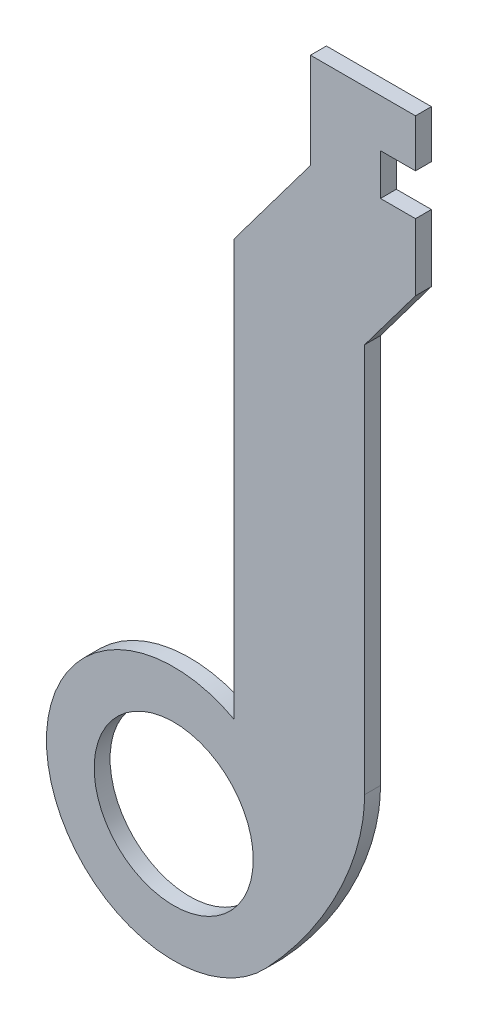
ISO-10303-21;
HEADER;
FILE_DESCRIPTION(('STEP AP214'),'2;1');
FILE_NAME('part.step','',(''),(''),'','','');
FILE_SCHEMA(('AUTOMOTIVE_DESIGN { 1 0 10303 214 1 1 1 1 }'));
ENDSEC;
DATA;
#1=APPLICATION_CONTEXT('core data for automotive mechanical design processes');
#2=APPLICATION_PROTOCOL_DEFINITION('international standard','automotive_design',2000,#1);
#3=PRODUCT_CONTEXT('',#1,'mechanical');
#4=PRODUCT('Part','Part','',(#3));
#5=PRODUCT_RELATED_PRODUCT_CATEGORY('part','',(#4));
#6=PRODUCT_DEFINITION_FORMATION('','',#4);
#7=PRODUCT_DEFINITION_CONTEXT('part definition',#1,'design');
#8=PRODUCT_DEFINITION('design','',#6,#7);
#9=PRODUCT_DEFINITION_SHAPE('','',#8);
#10=(LENGTH_UNIT() NAMED_UNIT(*) SI_UNIT(.MILLI.,.METRE.));
#11=(NAMED_UNIT(*) PLANE_ANGLE_UNIT() SI_UNIT($,.RADIAN.));
#12=(NAMED_UNIT(*) SI_UNIT($,.STERADIAN.) SOLID_ANGLE_UNIT());
#13=UNCERTAINTY_MEASURE_WITH_UNIT(LENGTH_MEASURE(1.E-05),#10,'distance_accuracy_value','');
#14=(GEOMETRIC_REPRESENTATION_CONTEXT(3) GLOBAL_UNCERTAINTY_ASSIGNED_CONTEXT((#13)) GLOBAL_UNIT_ASSIGNED_CONTEXT((#10,
#11,#12)) REPRESENTATION_CONTEXT('',''));
#15=CARTESIAN_POINT('',(0.,0.,0.));
#16=DIRECTION('',(0.,0.,1.));
#17=DIRECTION('',(1.,0.,0.));
#18=AXIS2_PLACEMENT_3D('',#15,#16,#17);
#19=CARTESIAN_POINT('',(-3.3,0.,0.5));
#20=DIRECTION('',(0.,-1.,0.));
#21=DIRECTION('',(0.,0.,-1.));
#22=AXIS2_PLACEMENT_3D('',#19,#20,#21);
#23=PLANE('',#22);
#24=DIRECTION('',(-1.,0.,0.));
#25=VECTOR('',#24,1.);
#26=CARTESIAN_POINT('',(-3.3,0.,0.));
#27=LINE('',#26,#25);
#28=CARTESIAN_POINT('',(0.,0.,0.));
#29=VERTEX_POINT('',#28);
#30=CARTESIAN_POINT('',(-3.3,0.,0.));
#31=VERTEX_POINT('',#30);
#32=EDGE_CURVE('E170',#29,#31,#27,.T.);
#33=ORIENTED_EDGE('',*,*,#32,.T.);
#34=DIRECTION('',(0.,0.,-1.));
#35=VECTOR('',#34,1.);
#36=CARTESIAN_POINT('',(-3.3,0.,0.5));
#37=LINE('',#36,#35);
#38=CARTESIAN_POINT('',(-3.3,0.,0.5));
#39=VERTEX_POINT('',#38);
#40=EDGE_CURVE('E11',#39,#31,#37,.T.);
#41=ORIENTED_EDGE('',*,*,#40,.F.);
#42=DIRECTION('',(-1.,0.,0.));
#43=VECTOR('',#42,1.);
#44=CARTESIAN_POINT('',(-3.3,0.,0.5));
#45=LINE('',#44,#43);
#46=CARTESIAN_POINT('',(0.,0.,0.5));
#47=VERTEX_POINT('',#46);
#48=EDGE_CURVE('E208',#47,#39,#45,.T.);
#49=ORIENTED_EDGE('',*,*,#48,.F.);
#50=DIRECTION('',(0.,0.,-1.));
#51=VECTOR('',#50,1.);
#52=CARTESIAN_POINT('',(0.,0.,0.5));
#53=LINE('',#52,#51);
#54=EDGE_CURVE('E166',#47,#29,#53,.T.);
#55=ORIENTED_EDGE('',*,*,#54,.T.);
#56=EDGE_LOOP('',(#33,#41,#49,#55));
#57=FACE_BOUND('',#56,.T.);
#58=ADVANCED_FACE('F39',(#57),#23,.F.);
#59=CARTESIAN_POINT('',(-3.3,-3.,0.5));
#60=DIRECTION('',(1.,0.,0.));
#61=DIRECTION('',(0.,0.,-1.));
#62=AXIS2_PLACEMENT_3D('',#59,#60,#61);
#63=PLANE('',#62);
#64=DIRECTION('',(0.,-1.,0.));
#65=VECTOR('',#64,1.);
#66=CARTESIAN_POINT('',(-3.3,-3.,0.));
#67=LINE('',#66,#65);
#68=CARTESIAN_POINT('',(-3.3,-3.,0.));
#69=VERTEX_POINT('',#68);
#70=EDGE_CURVE('E174',#31,#69,#67,.T.);
#71=ORIENTED_EDGE('',*,*,#70,.T.);
#72=DIRECTION('',(0.,0.,-1.));
#73=VECTOR('',#72,1.);
#74=CARTESIAN_POINT('',(-3.3,-3.,0.5));
#75=LINE('',#74,#73);
#76=CARTESIAN_POINT('',(-3.3,-3.,0.5));
#77=VERTEX_POINT('',#76);
#78=EDGE_CURVE('E48',#77,#69,#75,.T.);
#79=ORIENTED_EDGE('',*,*,#78,.F.);
#80=DIRECTION('',(0.,-1.,0.));
#81=VECTOR('',#80,1.);
#82=CARTESIAN_POINT('',(-3.3,-3.,0.5));
#83=LINE('',#82,#81);
#84=EDGE_CURVE('E114',#39,#77,#83,.T.);
#85=ORIENTED_EDGE('',*,*,#84,.F.);
#86=ORIENTED_EDGE('',*,*,#40,.T.);
#87=EDGE_LOOP('',(#71,#79,#85,#86));
#88=FACE_BOUND('',#87,.T.);
#89=ADVANCED_FACE('F292',(#88),#63,.F.);
#90=CARTESIAN_POINT('',(-5.7,-6.2,0.5));
#91=DIRECTION('',(0.8,-0.6,0.));
#92=DIRECTION('',(0.6,0.8,0.));
#93=AXIS2_PLACEMENT_3D('',#90,#91,#92);
#94=PLANE('',#93);
#95=DIRECTION('',(-0.6,-0.8,0.));
#96=VECTOR('',#95,1.);
#97=CARTESIAN_POINT('',(-5.7,-6.2,0.));
#98=LINE('',#97,#96);
#99=CARTESIAN_POINT('',(-5.7,-6.2,0.));
#100=VERTEX_POINT('',#99);
#101=EDGE_CURVE('E178',#69,#100,#98,.T.);
#102=ORIENTED_EDGE('',*,*,#101,.T.);
#103=DIRECTION('',(0.,0.,-1.));
#104=VECTOR('',#103,1.);
#105=CARTESIAN_POINT('',(-5.7,-6.2,0.5));
#106=LINE('',#105,#104);
#107=CARTESIAN_POINT('',(-5.7,-6.2,0.5));
#108=VERTEX_POINT('',#107);
#109=EDGE_CURVE('E239',#108,#100,#106,.T.);
#110=ORIENTED_EDGE('',*,*,#109,.F.);
#111=DIRECTION('',(-0.6,-0.8,0.));
#112=VECTOR('',#111,1.);
#113=CARTESIAN_POINT('',(-5.7,-6.2,0.5));
#114=LINE('',#113,#112);
#115=EDGE_CURVE('E249',#77,#108,#114,.T.);
#116=ORIENTED_EDGE('',*,*,#115,.F.);
#117=ORIENTED_EDGE('',*,*,#78,.T.);
#118=EDGE_LOOP('',(#102,#110,#116,#117));
#119=FACE_BOUND('',#118,.T.);
#120=ADVANCED_FACE('F247',(#119),#94,.F.);
#121=CARTESIAN_POINT('',(-5.7,-19.2800568186404,0.5));
#122=DIRECTION('',(1.,0.,0.));
#123=DIRECTION('',(0.,1.,0.));
#124=AXIS2_PLACEMENT_3D('',#121,#122,#123);
#125=PLANE('',#124);
#126=DIRECTION('',(0.,-1.,0.));
#127=VECTOR('',#126,1.);
#128=CARTESIAN_POINT('',(-5.7,-19.2800568186404,0.));
#129=LINE('',#128,#127);
#130=CARTESIAN_POINT('',(-5.7,-19.2800568186404,0.));
#131=VERTEX_POINT('',#130);
#132=EDGE_CURVE('E181',#100,#131,#129,.T.);
#133=ORIENTED_EDGE('',*,*,#132,.T.);
#134=DIRECTION('',(0.,0.,-1.));
#135=VECTOR('',#134,1.);
#136=CARTESIAN_POINT('',(-5.7,-19.2800568186404,0.5));
#137=LINE('',#136,#135);
#138=CARTESIAN_POINT('',(-5.7,-19.2800568186404,0.5));
#139=VERTEX_POINT('',#138);
#140=EDGE_CURVE('E235',#139,#131,#137,.T.);
#141=ORIENTED_EDGE('',*,*,#140,.F.);
#142=DIRECTION('',(0.,-1.,0.));
#143=VECTOR('',#142,1.);
#144=CARTESIAN_POINT('',(-5.7,-19.2800568186404,0.5));
#145=LINE('',#144,#143);
#146=EDGE_CURVE('E268',#108,#139,#145,.T.);
#147=ORIENTED_EDGE('',*,*,#146,.F.);
#148=ORIENTED_EDGE('',*,*,#109,.T.);
#149=EDGE_LOOP('',(#133,#141,#147,#148));
#150=FACE_BOUND('',#149,.T.);
#151=ADVANCED_FACE('F258',(#150),#125,.F.);
#152=CARTESIAN_POINT('',(-7.59999999999999,-22.8,0.5));
#153=DIRECTION('',(0.,0.,-1.));
#154=DIRECTION('',(-1.,0.,0.));
#155=AXIS2_PLACEMENT_3D('',#152,#153,#154);
#156=CYLINDRICAL_SURFACE('',#155,4.);
#157=CARTESIAN_POINT('',(-7.59999999999999,-22.8,0.));
#158=DIRECTION('',(0.,0.,1.));
#159=DIRECTION('',(1.,0.,0.));
#160=AXIS2_PLACEMENT_3D('',#157,#158,#159);
#161=CIRCLE('',#160,4.);
#162=CARTESIAN_POINT('',(-4.69563331403691,-25.5503916363798,0.));
#163=VERTEX_POINT('',#162);
#164=EDGE_CURVE('E184',#131,#163,#161,.T.);
#165=ORIENTED_EDGE('',*,*,#164,.T.);
#166=DIRECTION('',(0.,0.,-1.));
#167=VECTOR('',#166,1.);
#168=CARTESIAN_POINT('',(-4.69563331403691,-25.5503916363798,0.5));
#169=LINE('',#168,#167);
#170=CARTESIAN_POINT('',(-4.69563331403691,-25.5503916363798,0.5));
#171=VERTEX_POINT('',#170);
#172=EDGE_CURVE('E231',#171,#163,#169,.T.);
#173=ORIENTED_EDGE('',*,*,#172,.F.);
#174=CARTESIAN_POINT('',(-7.59999999999999,-22.8,0.5));
#175=DIRECTION('',(0.,0.,1.));
#176=DIRECTION('',(1.,0.,0.));
#177=AXIS2_PLACEMENT_3D('',#174,#175,#176);
#178=CIRCLE('',#177,4.);
#179=EDGE_CURVE('E264',#139,#171,#178,.T.);
#180=ORIENTED_EDGE('',*,*,#179,.F.);
#181=ORIENTED_EDGE('',*,*,#140,.T.);
#182=EDGE_LOOP('',(#165,#173,#180,#181));
#183=FACE_BOUND('',#182,.T.);
#184=ADVANCED_FACE('F262',(#183),#156,.T.);
#185=CARTESIAN_POINT('',(-7.59999999999999,-22.8,0.5));
#186=DIRECTION('',(0.,0.,1.));
#187=DIRECTION('',(0.687597909094946,0.726091671490769,0.));
#188=AXIS2_PLACEMENT_3D('',#185,#186,#187);
#189=ELLIPSE('',#188,7.6355746345642,4.00000000000001);
#190=DIRECTION('',(0.,0.,-1.));
#191=VECTOR('',#190,1.);
#192=SURFACE_OF_LINEAR_EXTRUSION('',#189,#191);
#193=CARTESIAN_POINT('',(-7.59999999999999,-22.8,0.));
#194=DIRECTION('',(0.,0.,1.));
#195=DIRECTION('',(0.687597909094946,0.726091671490769,0.));
#196=AXIS2_PLACEMENT_3D('',#193,#194,#195);
#197=ELLIPSE('',#196,7.6355746345642,4.00000000000001);
#198=CARTESIAN_POINT('',(-1.6,-19.2800568186404,0.));
#199=VERTEX_POINT('',#198);
#200=EDGE_CURVE('E187',#163,#199,#197,.T.);
#201=ORIENTED_EDGE('',*,*,#200,.T.);
#202=DIRECTION('',(0.,0.,-1.));
#203=VECTOR('',#202,1.);
#204=CARTESIAN_POINT('',(-1.6,-19.2800568186404,0.5));
#205=LINE('',#204,#203);
#206=CARTESIAN_POINT('',(-1.6,-19.2800568186404,0.5));
#207=VERTEX_POINT('',#206);
#208=EDGE_CURVE('E227',#207,#199,#205,.T.);
#209=ORIENTED_EDGE('',*,*,#208,.F.);
#210=EDGE_CURVE('E267',#171,#207,#189,.T.);
#211=ORIENTED_EDGE('',*,*,#210,.F.);
#212=ORIENTED_EDGE('',*,*,#172,.T.);
#213=EDGE_LOOP('',(#201,#209,#211,#212));
#214=FACE_BOUND('',#213,.T.);
#215=ADVANCED_FACE('F280',(#214),#192,.F.);
#216=CARTESIAN_POINT('',(-1.6,-7.03333333333333,0.5));
#217=DIRECTION('',(-1.,0.,0.));
#218=DIRECTION('',(0.,0.,1.));
#219=AXIS2_PLACEMENT_3D('',#216,#217,#218);
#220=PLANE('',#219);
#221=DIRECTION('',(0.,1.,0.));
#222=VECTOR('',#221,1.);
#223=CARTESIAN_POINT('',(-1.6,-7.03333333333333,0.));
#224=LINE('',#223,#222);
#225=CARTESIAN_POINT('',(-1.6,-7.03333333333333,0.));
#226=VERTEX_POINT('',#225);
#227=EDGE_CURVE('E190',#199,#226,#224,.T.);
#228=ORIENTED_EDGE('',*,*,#227,.T.);
#229=DIRECTION('',(0.,0.,-1.));
#230=VECTOR('',#229,1.);
#231=CARTESIAN_POINT('',(-1.6,-7.03333333333333,0.5));
#232=LINE('',#231,#230);
#233=CARTESIAN_POINT('',(-1.6,-7.03333333333333,0.5));
#234=VERTEX_POINT('',#233);
#235=EDGE_CURVE('E223',#234,#226,#232,.T.);
#236=ORIENTED_EDGE('',*,*,#235,.F.);
#237=DIRECTION('',(0.,1.,0.));
#238=VECTOR('',#237,1.);
#239=CARTESIAN_POINT('',(-1.6,-7.03333333333333,0.5));
#240=LINE('',#239,#238);
#241=EDGE_CURVE('E272',#207,#234,#240,.T.);
#242=ORIENTED_EDGE('',*,*,#241,.F.);
#243=ORIENTED_EDGE('',*,*,#208,.T.);
#244=EDGE_LOOP('',(#228,#236,#242,#243));
#245=FACE_BOUND('',#244,.T.);
#246=ADVANCED_FACE('F284',(#245),#220,.F.);
#247=CARTESIAN_POINT('',(0.,-4.9,0.5));
#248=DIRECTION('',(-0.8,0.600000000000001,0.));
#249=DIRECTION('',(-0.600000000000001,-0.8,0.));
#250=AXIS2_PLACEMENT_3D('',#247,#248,#249);
#251=PLANE('',#250);
#252=DIRECTION('',(0.600000000000001,0.8,0.));
#253=VECTOR('',#252,1.);
#254=CARTESIAN_POINT('',(0.,-4.9,0.));
#255=LINE('',#254,#253);
#256=CARTESIAN_POINT('',(0.,-4.9,0.));
#257=VERTEX_POINT('',#256);
#258=EDGE_CURVE('E193',#226,#257,#255,.T.);
#259=ORIENTED_EDGE('',*,*,#258,.T.);
#260=DIRECTION('',(0.,0.,-1.));
#261=VECTOR('',#260,1.);
#262=CARTESIAN_POINT('',(0.,-4.9,0.5));
#263=LINE('',#262,#261);
#264=CARTESIAN_POINT('',(0.,-4.9,0.5));
#265=VERTEX_POINT('',#264);
#266=EDGE_CURVE('E219',#265,#257,#263,.T.);
#267=ORIENTED_EDGE('',*,*,#266,.F.);
#268=DIRECTION('',(0.600000000000001,0.8,0.));
#269=VECTOR('',#268,1.);
#270=CARTESIAN_POINT('',(0.,-4.9,0.5));
#271=LINE('',#270,#269);
#272=EDGE_CURVE('E314',#234,#265,#271,.T.);
#273=ORIENTED_EDGE('',*,*,#272,.F.);
#274=ORIENTED_EDGE('',*,*,#235,.T.);
#275=EDGE_LOOP('',(#259,#267,#273,#274));
#276=FACE_BOUND('',#275,.T.);
#277=ADVANCED_FACE('F313',(#276),#251,.F.);
#278=CARTESIAN_POINT('',(0.,-2.8,0.5));
#279=DIRECTION('',(-1.,0.,0.));
#280=DIRECTION('',(0.,-1.,0.));
#281=AXIS2_PLACEMENT_3D('',#278,#279,#280);
#282=PLANE('',#281);
#283=DIRECTION('',(0.,1.,0.));
#284=VECTOR('',#283,1.);
#285=CARTESIAN_POINT('',(0.,-2.8,0.));
#286=LINE('',#285,#284);
#287=CARTESIAN_POINT('',(0.,-2.8,0.));
#288=VERTEX_POINT('',#287);
#289=EDGE_CURVE('E196',#257,#288,#286,.T.);
#290=ORIENTED_EDGE('',*,*,#289,.T.);
#291=DIRECTION('',(0.,0.,-1.));
#292=VECTOR('',#291,1.);
#293=CARTESIAN_POINT('',(0.,-2.8,0.5));
#294=LINE('',#293,#292);
#295=CARTESIAN_POINT('',(0.,-2.8,0.5));
#296=VERTEX_POINT('',#295);
#297=EDGE_CURVE('E215',#296,#288,#294,.T.);
#298=ORIENTED_EDGE('',*,*,#297,.F.);
#299=DIRECTION('',(0.,1.,0.));
#300=VECTOR('',#299,1.);
#301=CARTESIAN_POINT('',(0.,-2.8,0.5));
#302=LINE('',#301,#300);
#303=EDGE_CURVE('E309',#265,#296,#302,.T.);
#304=ORIENTED_EDGE('',*,*,#303,.F.);
#305=ORIENTED_EDGE('',*,*,#266,.T.);
#306=EDGE_LOOP('',(#290,#298,#304,#305));
#307=FACE_BOUND('',#306,.T.);
#308=ADVANCED_FACE('F308',(#307),#282,.F.);
#309=CARTESIAN_POINT('',(-1.1,-2.8,0.5));
#310=DIRECTION('',(0.,-1.,0.));
#311=DIRECTION('',(0.,0.,-1.));
#312=AXIS2_PLACEMENT_3D('',#309,#310,#311);
#313=PLANE('',#312);
#314=DIRECTION('',(-1.,0.,0.));
#315=VECTOR('',#314,1.);
#316=CARTESIAN_POINT('',(-1.1,-2.8,0.));
#317=LINE('',#316,#315);
#318=CARTESIAN_POINT('',(-1.1,-2.8,0.));
#319=VERTEX_POINT('',#318);
#320=EDGE_CURVE('E199',#288,#319,#317,.T.);
#321=ORIENTED_EDGE('',*,*,#320,.T.);
#322=DIRECTION('',(0.,0.,-1.));
#323=VECTOR('',#322,1.);
#324=CARTESIAN_POINT('',(-1.1,-2.8,0.5));
#325=LINE('',#324,#323);
#326=CARTESIAN_POINT('',(-1.1,-2.8,0.5));
#327=VERTEX_POINT('',#326);
#328=EDGE_CURVE('E159',#327,#319,#325,.T.);
#329=ORIENTED_EDGE('',*,*,#328,.F.);
#330=DIRECTION('',(-1.,0.,0.));
#331=VECTOR('',#330,1.);
#332=CARTESIAN_POINT('',(-1.1,-2.8,0.5));
#333=LINE('',#332,#331);
#334=EDGE_CURVE('E148',#296,#327,#333,.T.);
#335=ORIENTED_EDGE('',*,*,#334,.F.);
#336=ORIENTED_EDGE('',*,*,#297,.T.);
#337=EDGE_LOOP('',(#321,#329,#335,#336));
#338=FACE_BOUND('',#337,.T.);
#339=ADVANCED_FACE('F304',(#338),#313,.F.);
#340=CARTESIAN_POINT('',(-1.1,-1.5,0.5));
#341=DIRECTION('',(-1.,0.,0.));
#342=DIRECTION('',(0.,-1.,0.));
#343=AXIS2_PLACEMENT_3D('',#340,#341,#342);
#344=PLANE('',#343);
#345=DIRECTION('',(0.,1.,0.));
#346=VECTOR('',#345,1.);
#347=CARTESIAN_POINT('',(-1.1,-1.5,0.));
#348=LINE('',#347,#346);
#349=CARTESIAN_POINT('',(-1.1,-1.5,0.));
#350=VERTEX_POINT('',#349);
#351=EDGE_CURVE('E157',#319,#350,#348,.T.);
#352=ORIENTED_EDGE('',*,*,#351,.T.);
#353=DIRECTION('',(0.,0.,-1.));
#354=VECTOR('',#353,1.);
#355=CARTESIAN_POINT('',(-1.1,-1.5,0.5));
#356=LINE('',#355,#354);
#357=CARTESIAN_POINT('',(-1.1,-1.5,0.5));
#358=VERTEX_POINT('',#357);
#359=EDGE_CURVE('E154',#358,#350,#356,.T.);
#360=ORIENTED_EDGE('',*,*,#359,.F.);
#361=DIRECTION('',(0.,1.,0.));
#362=VECTOR('',#361,1.);
#363=CARTESIAN_POINT('',(-1.1,-1.5,0.5));
#364=LINE('',#363,#362);
#365=EDGE_CURVE('E142',#327,#358,#364,.T.);
#366=ORIENTED_EDGE('',*,*,#365,.F.);
#367=ORIENTED_EDGE('',*,*,#328,.T.);
#368=EDGE_LOOP('',(#352,#360,#366,#367));
#369=FACE_BOUND('',#368,.T.);
#370=ADVANCED_FACE('F155',(#369),#344,.F.);
#371=CARTESIAN_POINT('',(0.,-1.5,0.5));
#372=DIRECTION('',(0.,1.,0.));
#373=DIRECTION('',(-1.,0.,0.));
#374=AXIS2_PLACEMENT_3D('',#371,#372,#373);
#375=PLANE('',#374);
#376=DIRECTION('',(1.,0.,0.));
#377=VECTOR('',#376,1.);
#378=CARTESIAN_POINT('',(0.,-1.5,0.));
#379=LINE('',#378,#377);
#380=CARTESIAN_POINT('',(0.,-1.5,0.));
#381=VERTEX_POINT('',#380);
#382=EDGE_CURVE('E100',#350,#381,#379,.T.);
#383=ORIENTED_EDGE('',*,*,#382,.T.);
#384=DIRECTION('',(0.,0.,-1.));
#385=VECTOR('',#384,1.);
#386=CARTESIAN_POINT('',(0.,-1.5,0.5));
#387=LINE('',#386,#385);
#388=CARTESIAN_POINT('',(0.,-1.5,0.5));
#389=VERTEX_POINT('',#388);
#390=EDGE_CURVE('E160',#389,#381,#387,.T.);
#391=ORIENTED_EDGE('',*,*,#390,.F.);
#392=DIRECTION('',(1.,0.,0.));
#393=VECTOR('',#392,1.);
#394=CARTESIAN_POINT('',(0.,-1.5,0.5));
#395=LINE('',#394,#393);
#396=EDGE_CURVE('E146',#358,#389,#395,.T.);
#397=ORIENTED_EDGE('',*,*,#396,.F.);
#398=ORIENTED_EDGE('',*,*,#359,.T.);
#399=EDGE_LOOP('',(#383,#391,#397,#398));
#400=FACE_BOUND('',#399,.T.);
#401=ADVANCED_FACE('F162',(#400),#375,.F.);
#402=CARTESIAN_POINT('',(0.,0.,0.5));
#403=DIRECTION('',(-1.,0.,0.));
#404=DIRECTION('',(0.,-1.,0.));
#405=AXIS2_PLACEMENT_3D('',#402,#403,#404);
#406=PLANE('',#405);
#407=DIRECTION('',(0.,1.,0.));
#408=VECTOR('',#407,1.);
#409=CARTESIAN_POINT('',(0.,0.,0.));
#410=LINE('',#409,#408);
#411=EDGE_CURVE('E106',#381,#29,#410,.T.);
#412=ORIENTED_EDGE('',*,*,#411,.T.);
#413=ORIENTED_EDGE('',*,*,#54,.F.);
#414=DIRECTION('',(0.,1.,0.));
#415=VECTOR('',#414,1.);
#416=CARTESIAN_POINT('',(0.,0.,0.5));
#417=LINE('',#416,#415);
#418=EDGE_CURVE('E56',#389,#47,#417,.T.);
#419=ORIENTED_EDGE('',*,*,#418,.F.);
#420=ORIENTED_EDGE('',*,*,#390,.T.);
#421=EDGE_LOOP('',(#412,#413,#419,#420));
#422=FACE_BOUND('',#421,.T.);
#423=ADVANCED_FACE('F340',(#422),#406,.F.);
#424=CARTESIAN_POINT('',(-7.59999999999999,-22.8,0.5));
#425=DIRECTION('',(0.,0.,1.));
#426=DIRECTION('',(1.,0.,0.));
#427=AXIS2_PLACEMENT_3D('',#424,#425,#426);
#428=PLANE('',#427);
#429=CARTESIAN_POINT('',(-7.59999999999999,-22.8,0.5));
#430=DIRECTION('',(0.,0.,1.));
#431=DIRECTION('',(1.,0.,0.));
#432=AXIS2_PLACEMENT_3D('',#429,#430,#431);
#433=CIRCLE('',#432,2.5);
#434=CARTESIAN_POINT('',(-5.09999999999999,-22.8,0.5));
#435=VERTEX_POINT('',#434);
#436=EDGE_CURVE('E357',#435,#435,#433,.T.);
#437=ORIENTED_EDGE('',*,*,#436,.F.);
#438=EDGE_LOOP('',(#437));
#439=FACE_BOUND('',#438,.T.);
#440=ORIENTED_EDGE('',*,*,#48,.T.);
#441=ORIENTED_EDGE('',*,*,#84,.T.);
#442=ORIENTED_EDGE('',*,*,#115,.T.);
#443=ORIENTED_EDGE('',*,*,#146,.T.);
#444=ORIENTED_EDGE('',*,*,#179,.T.);
#445=ORIENTED_EDGE('',*,*,#210,.T.);
#446=ORIENTED_EDGE('',*,*,#241,.T.);
#447=ORIENTED_EDGE('',*,*,#272,.T.);
#448=ORIENTED_EDGE('',*,*,#303,.T.);
#449=ORIENTED_EDGE('',*,*,#334,.T.);
#450=ORIENTED_EDGE('',*,*,#365,.T.);
#451=ORIENTED_EDGE('',*,*,#396,.T.);
#452=ORIENTED_EDGE('',*,*,#418,.T.);
#453=EDGE_LOOP('',(#440,#441,#442,#443,#444,#445,#446,#447,#448,#449,#450,#451,#452));
#454=FACE_BOUND('',#453,.T.);
#455=ADVANCED_FACE('F144',(#439,#454),#428,.T.);
#456=CARTESIAN_POINT('',(-7.59999999999999,-22.8,0.));
#457=DIRECTION('',(0.,0.,1.));
#458=DIRECTION('',(1.,0.,0.));
#459=AXIS2_PLACEMENT_3D('',#456,#457,#458);
#460=PLANE('',#459);
#461=CARTESIAN_POINT('',(-7.59999999999999,-22.8,0.));
#462=DIRECTION('',(0.,0.,1.));
#463=DIRECTION('',(1.,0.,0.));
#464=AXIS2_PLACEMENT_3D('',#461,#462,#463);
#465=CIRCLE('',#464,2.5);
#466=CARTESIAN_POINT('',(-5.09999999999999,-22.8,0.));
#467=VERTEX_POINT('',#466);
#468=EDGE_CURVE('E175',#467,#467,#465,.F.);
#469=ORIENTED_EDGE('',*,*,#468,.F.);
#470=EDGE_LOOP('',(#469));
#471=FACE_BOUND('',#470,.T.);
#472=ORIENTED_EDGE('',*,*,#32,.F.);
#473=ORIENTED_EDGE('',*,*,#411,.F.);
#474=ORIENTED_EDGE('',*,*,#382,.F.);
#475=ORIENTED_EDGE('',*,*,#351,.F.);
#476=ORIENTED_EDGE('',*,*,#320,.F.);
#477=ORIENTED_EDGE('',*,*,#289,.F.);
#478=ORIENTED_EDGE('',*,*,#258,.F.);
#479=ORIENTED_EDGE('',*,*,#227,.F.);
#480=ORIENTED_EDGE('',*,*,#200,.F.);
#481=ORIENTED_EDGE('',*,*,#164,.F.);
#482=ORIENTED_EDGE('',*,*,#132,.F.);
#483=ORIENTED_EDGE('',*,*,#101,.F.);
#484=ORIENTED_EDGE('',*,*,#70,.F.);
#485=EDGE_LOOP('',(#472,#473,#474,#475,#476,#477,#478,#479,#480,#481,#482,#483,#484));
#486=FACE_BOUND('',#485,.T.);
#487=ADVANCED_FACE('F253',(#471,#486),#460,.F.);
#488=CARTESIAN_POINT('',(-7.59999999999999,-22.8,-0.00100000000000002));
#489=DIRECTION('',(0.,0.,1.));
#490=DIRECTION('',(1.,0.,0.));
#491=AXIS2_PLACEMENT_3D('',#488,#489,#490);
#492=CYLINDRICAL_SURFACE('',#491,2.5);
#493=ORIENTED_EDGE('',*,*,#436,.T.);
#494=EDGE_LOOP('',(#493));
#495=FACE_BOUND('',#494,.T.);
#496=ORIENTED_EDGE('',*,*,#468,.T.);
#497=EDGE_LOOP('',(#496));
#498=FACE_BOUND('',#497,.T.);
#499=ADVANCED_FACE('F345',(#495,#498),#492,.F.);
#500=CLOSED_SHELL('',(#58,#89,#120,#151,#184,#215,#246,#277,#308,#339,#370,#401,#423,#455,#487,#499));
#501=MANIFOLD_SOLID_BREP('B2',#500);
#502=ADVANCED_BREP_SHAPE_REPRESENTATION('',(#18,#501),#14);
#503=SHAPE_DEFINITION_REPRESENTATION(#9,#502);
ENDSEC;
END-ISO-10303-21;
